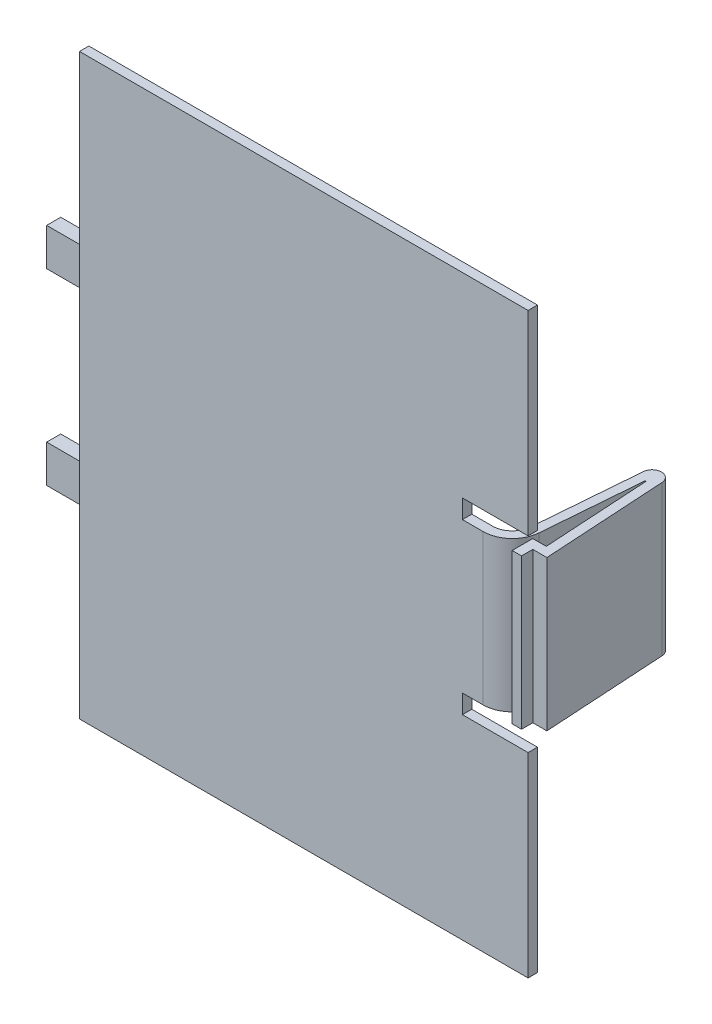
ISO-10303-21;
HEADER;
FILE_DESCRIPTION(('STEP AP214'),'2;1');
FILE_NAME('part.step','',(''),(''),'','','');
FILE_SCHEMA(('AUTOMOTIVE_DESIGN { 1 0 10303 214 1 1 1 1 }'));
ENDSEC;
DATA;
#1=APPLICATION_CONTEXT('core data for automotive mechanical design processes');
#2=APPLICATION_PROTOCOL_DEFINITION('international standard','automotive_design',2000,#1);
#3=PRODUCT_CONTEXT('',#1,'mechanical');
#4=PRODUCT('Part','Part','',(#3));
#5=PRODUCT_RELATED_PRODUCT_CATEGORY('part','',(#4));
#6=PRODUCT_DEFINITION_FORMATION('','',#4);
#7=PRODUCT_DEFINITION_CONTEXT('part definition',#1,'design');
#8=PRODUCT_DEFINITION('design','',#6,#7);
#9=PRODUCT_DEFINITION_SHAPE('','',#8);
#10=(LENGTH_UNIT() NAMED_UNIT(*) SI_UNIT(.MILLI.,.METRE.));
#11=(NAMED_UNIT(*) PLANE_ANGLE_UNIT() SI_UNIT($,.RADIAN.));
#12=(NAMED_UNIT(*) SI_UNIT($,.STERADIAN.) SOLID_ANGLE_UNIT());
#13=UNCERTAINTY_MEASURE_WITH_UNIT(LENGTH_MEASURE(1.E-05),#10,'distance_accuracy_value','');
#14=(GEOMETRIC_REPRESENTATION_CONTEXT(3) GLOBAL_UNCERTAINTY_ASSIGNED_CONTEXT((#13)) GLOBAL_UNIT_ASSIGNED_CONTEXT((#10,
#11,#12)) REPRESENTATION_CONTEXT('',''));
#15=CARTESIAN_POINT('',(0.,0.,0.));
#16=DIRECTION('',(0.,0.,1.));
#17=DIRECTION('',(1.,0.,0.));
#18=AXIS2_PLACEMENT_3D('',#15,#16,#17);
#19=CARTESIAN_POINT('',(-70.,0.,-1.));
#20=DIRECTION('',(1.,0.,0.));
#21=DIRECTION('',(0.,0.,-1.));
#22=AXIS2_PLACEMENT_3D('',#19,#20,#21);
#23=PLANE('',#22);
#24=DIRECTION('',(0.,1.,0.));
#25=VECTOR('',#24,1.);
#26=CARTESIAN_POINT('',(-70.,0.,-1.));
#27=LINE('',#26,#25);
#28=CARTESIAN_POINT('',(-70.,-10.,-1.));
#29=VERTEX_POINT('',#28);
#30=CARTESIAN_POINT('',(-70.,-8.,-1.));
#31=VERTEX_POINT('',#30);
#32=EDGE_CURVE('E452',#29,#31,#27,.T.);
#33=ORIENTED_EDGE('',*,*,#32,.T.);
#34=DIRECTION('',(0.,0.,1.));
#35=VECTOR('',#34,1.);
#36=CARTESIAN_POINT('',(-70.,-8.,-1.));
#37=LINE('',#36,#35);
#38=CARTESIAN_POINT('',(-70.,-8.,0.));
#39=VERTEX_POINT('',#38);
#40=EDGE_CURVE('E347',#31,#39,#37,.T.);
#41=ORIENTED_EDGE('',*,*,#40,.T.);
#42=DIRECTION('',(0.,1.,0.));
#43=VECTOR('',#42,1.);
#44=CARTESIAN_POINT('',(-70.,0.,0.));
#45=LINE('',#44,#43);
#46=CARTESIAN_POINT('',(-70.,-10.,0.));
#47=VERTEX_POINT('',#46);
#48=EDGE_CURVE('E478',#47,#39,#45,.T.);
#49=ORIENTED_EDGE('',*,*,#48,.F.);
#50=DIRECTION('',(0.,0.,1.));
#51=VECTOR('',#50,1.);
#52=CARTESIAN_POINT('',(-70.,-10.,-1.));
#53=LINE('',#52,#51);
#54=EDGE_CURVE('E44',#29,#47,#53,.T.);
#55=ORIENTED_EDGE('',*,*,#54,.F.);
#56=EDGE_LOOP('',(#33,#41,#49,#55));
#57=FACE_BOUND('',#56,.T.);
#58=ADVANCED_FACE('F35',(#57),#23,.T.);
#59=CARTESIAN_POINT('',(0.,0.,-1.));
#60=DIRECTION('',(0.,0.,1.));
#61=DIRECTION('',(1.,0.,0.));
#62=AXIS2_PLACEMENT_3D('',#59,#60,#61);
#63=PLANE('',#62);
#64=DIRECTION('',(-1.,0.,0.));
#65=VECTOR('',#64,1.);
#66=CARTESIAN_POINT('',(-115.3,8.00000000000001,-1.));
#67=LINE('',#66,#65);
#68=CARTESIAN_POINT('',(-106.3,8.00000000000001,-1.));
#69=VERTEX_POINT('',#68);
#70=CARTESIAN_POINT('',(-110.8,8.00000000000001,-1.));
#71=VERTEX_POINT('',#70);
#72=EDGE_CURVE('E61',#69,#71,#67,.T.);
#73=ORIENTED_EDGE('',*,*,#72,.F.);
#74=DIRECTION('',(0.,-1.,0.));
#75=VECTOR('',#74,1.);
#76=CARTESIAN_POINT('',(-106.3,12.,-1.));
#77=LINE('',#76,#75);
#78=CARTESIAN_POINT('',(-106.3,12.,-1.));
#79=VERTEX_POINT('',#78);
#80=EDGE_CURVE('E366',#79,#69,#77,.T.);
#81=ORIENTED_EDGE('',*,*,#80,.F.);
#82=DIRECTION('',(1.,0.,0.));
#83=VECTOR('',#82,1.);
#84=CARTESIAN_POINT('',(-115.3,12.,-1.));
#85=LINE('',#84,#83);
#86=CARTESIAN_POINT('',(-110.8,12.,-1.));
#87=VERTEX_POINT('',#86);
#88=EDGE_CURVE('E407',#87,#79,#85,.T.);
#89=ORIENTED_EDGE('',*,*,#88,.F.);
#90=DIRECTION('',(0.,-1.,0.));
#91=VECTOR('',#90,1.);
#92=CARTESIAN_POINT('',(-110.8,0.,-1.));
#93=LINE('',#92,#91);
#94=CARTESIAN_POINT('',(-110.8,30.8,-1.));
#95=VERTEX_POINT('',#94);
#96=EDGE_CURVE('E467',#95,#87,#93,.T.);
#97=ORIENTED_EDGE('',*,*,#96,.F.);
#98=DIRECTION('',(-1.,0.,0.));
#99=VECTOR('',#98,1.);
#100=CARTESIAN_POINT('',(0.,30.8,-1.));
#101=LINE('',#100,#99);
#102=CARTESIAN_POINT('',(-63.,30.8,-1.));
#103=VERTEX_POINT('',#102);
#104=EDGE_CURVE('E462',#103,#95,#101,.T.);
#105=ORIENTED_EDGE('',*,*,#104,.F.);
#106=DIRECTION('',(0.,1.,0.));
#107=VECTOR('',#106,1.);
#108=CARTESIAN_POINT('',(-63.,0.,-1.));
#109=LINE('',#108,#107);
#110=CARTESIAN_POINT('',(-63.,9.99999999999999,-1.));
#111=VERTEX_POINT('',#110);
#112=EDGE_CURVE('E459',#111,#103,#109,.T.);
#113=ORIENTED_EDGE('',*,*,#112,.F.);
#114=DIRECTION('',(1.,0.,0.));
#115=VECTOR('',#114,1.);
#116=CARTESIAN_POINT('',(0.,9.99999999999999,-1.));
#117=LINE('',#116,#115);
#118=CARTESIAN_POINT('',(-70.,9.99999999999999,-1.));
#119=VERTEX_POINT('',#118);
#120=EDGE_CURVE('E455',#119,#111,#117,.T.);
#121=ORIENTED_EDGE('',*,*,#120,.F.);
#122=CARTESIAN_POINT('',(-70.,8.,-1.));
#123=VERTEX_POINT('',#122);
#124=EDGE_CURVE('E456',#123,#119,#27,.T.);
#125=ORIENTED_EDGE('',*,*,#124,.F.);
#126=DIRECTION('',(-1.,0.,0.));
#127=VECTOR('',#126,1.);
#128=CARTESIAN_POINT('',(-67.7876273887767,8.,-1.));
#129=LINE('',#128,#127);
#130=CARTESIAN_POINT('',(-67.7876273887767,8.,-1.));
#131=VERTEX_POINT('',#130);
#132=EDGE_CURVE('E306',#131,#123,#129,.T.);
#133=ORIENTED_EDGE('',*,*,#132,.F.);
#134=DIRECTION('',(0.,1.,0.));
#135=VECTOR('',#134,1.);
#136=CARTESIAN_POINT('',(-67.7876273887767,-8.,-1.));
#137=LINE('',#136,#135);
#138=CARTESIAN_POINT('',(-67.7876273887767,-8.,-1.));
#139=VERTEX_POINT('',#138);
#140=EDGE_CURVE('E375',#139,#131,#137,.T.);
#141=ORIENTED_EDGE('',*,*,#140,.F.);
#142=DIRECTION('',(-1.,0.,0.));
#143=VECTOR('',#142,1.);
#144=CARTESIAN_POINT('',(-67.7876273887767,-8.,-1.));
#145=LINE('',#144,#143);
#146=EDGE_CURVE('E344',#139,#31,#145,.T.);
#147=ORIENTED_EDGE('',*,*,#146,.T.);
#148=ORIENTED_EDGE('',*,*,#32,.F.);
#149=DIRECTION('',(1.,0.,0.));
#150=VECTOR('',#149,1.);
#151=CARTESIAN_POINT('',(0.,-10.,-1.));
#152=LINE('',#151,#150);
#153=CARTESIAN_POINT('',(-63.,-10.,-1.));
#154=VERTEX_POINT('',#153);
#155=EDGE_CURVE('E476',#29,#154,#152,.T.);
#156=ORIENTED_EDGE('',*,*,#155,.T.);
#157=CARTESIAN_POINT('',(-63.,-30.8,-1.));
#158=VERTEX_POINT('',#157);
#159=EDGE_CURVE('E463',#158,#154,#109,.T.);
#160=ORIENTED_EDGE('',*,*,#159,.F.);
#161=DIRECTION('',(1.,0.,0.));
#162=VECTOR('',#161,1.);
#163=CARTESIAN_POINT('',(0.,-30.8,-1.));
#164=LINE('',#163,#162);
#165=CARTESIAN_POINT('',(-110.8,-30.8,-1.));
#166=VERTEX_POINT('',#165);
#167=EDGE_CURVE('E470',#166,#158,#164,.T.);
#168=ORIENTED_EDGE('',*,*,#167,.F.);
#169=CARTESIAN_POINT('',(-110.8,-12.,-1.));
#170=VERTEX_POINT('',#169);
#171=EDGE_CURVE('E466',#170,#166,#93,.T.);
#172=ORIENTED_EDGE('',*,*,#171,.F.);
#173=DIRECTION('',(-1.,0.,0.));
#174=VECTOR('',#173,1.);
#175=CARTESIAN_POINT('',(-115.3,-12.,-1.));
#176=LINE('',#175,#174);
#177=CARTESIAN_POINT('',(-106.3,-12.,-1.));
#178=VERTEX_POINT('',#177);
#179=EDGE_CURVE('E434',#178,#170,#176,.T.);
#180=ORIENTED_EDGE('',*,*,#179,.F.);
#181=DIRECTION('',(0.,-1.,0.));
#182=VECTOR('',#181,1.);
#183=CARTESIAN_POINT('',(-106.3,-7.99999999999999,-1.));
#184=LINE('',#183,#182);
#185=CARTESIAN_POINT('',(-106.3,-7.99999999999999,-1.));
#186=VERTEX_POINT('',#185);
#187=EDGE_CURVE('E420',#186,#178,#184,.T.);
#188=ORIENTED_EDGE('',*,*,#187,.F.);
#189=DIRECTION('',(1.,0.,0.));
#190=VECTOR('',#189,1.);
#191=CARTESIAN_POINT('',(-115.3,-7.99999999999999,-1.));
#192=LINE('',#191,#190);
#193=CARTESIAN_POINT('',(-110.8,-7.99999999999999,-1.));
#194=VERTEX_POINT('',#193);
#195=EDGE_CURVE('E11',#194,#186,#192,.T.);
#196=ORIENTED_EDGE('',*,*,#195,.F.);
#197=EDGE_CURVE('E472',#71,#194,#93,.T.);
#198=ORIENTED_EDGE('',*,*,#197,.F.);
#199=EDGE_LOOP('',(#73,#81,#89,#97,#105,#113,#121,#125,#133,#141,#147,#148,#156,#160,#168,#172,
#180,#188,#196,#198));
#200=FACE_BOUND('',#199,.T.);
#201=ADVANCED_FACE('F559',(#200),#63,.F.);
#202=DIRECTION('',(0.,0.,1.));
#203=VECTOR('',#202,1.);
#204=CARTESIAN_POINT('',(-70.,8.,-1.));
#205=LINE('',#204,#203);
#206=CARTESIAN_POINT('',(-70.,8.,0.));
#207=VERTEX_POINT('',#206);
#208=EDGE_CURVE('E308',#123,#207,#205,.T.);
#209=ORIENTED_EDGE('',*,*,#208,.F.);
#210=ORIENTED_EDGE('',*,*,#124,.T.);
#211=DIRECTION('',(0.,0.,1.));
#212=VECTOR('',#211,1.);
#213=CARTESIAN_POINT('',(-70.,9.99999999999999,-1.));
#214=LINE('',#213,#212);
#215=CARTESIAN_POINT('',(-70.,9.99999999999999,0.));
#216=VERTEX_POINT('',#215);
#217=EDGE_CURVE('E39',#119,#216,#214,.T.);
#218=ORIENTED_EDGE('',*,*,#217,.T.);
#219=EDGE_CURVE('E451',#207,#216,#45,.T.);
#220=ORIENTED_EDGE('',*,*,#219,.F.);
#221=EDGE_LOOP('',(#209,#210,#218,#220));
#222=FACE_BOUND('',#221,.T.);
#223=ADVANCED_FACE('F37',(#222),#23,.T.);
#224=CARTESIAN_POINT('',(0.,-10.,-1.));
#225=DIRECTION('',(0.,-1.,0.));
#226=DIRECTION('',(0.,0.,-1.));
#227=AXIS2_PLACEMENT_3D('',#224,#225,#226);
#228=PLANE('',#227);
#229=DIRECTION('',(1.,0.,0.));
#230=VECTOR('',#229,1.);
#231=CARTESIAN_POINT('',(0.,-10.,0.));
#232=LINE('',#231,#230);
#233=CARTESIAN_POINT('',(-63.,-10.,0.));
#234=VERTEX_POINT('',#233);
#235=EDGE_CURVE('E497',#47,#234,#232,.T.);
#236=ORIENTED_EDGE('',*,*,#235,.T.);
#237=DIRECTION('',(0.,0.,1.));
#238=VECTOR('',#237,1.);
#239=CARTESIAN_POINT('',(-63.,-10.,-1.));
#240=LINE('',#239,#238);
#241=EDGE_CURVE('E501',#154,#234,#240,.T.);
#242=ORIENTED_EDGE('',*,*,#241,.F.);
#243=ORIENTED_EDGE('',*,*,#155,.F.);
#244=ORIENTED_EDGE('',*,*,#54,.T.);
#245=EDGE_LOOP('',(#236,#242,#243,#244));
#246=FACE_BOUND('',#245,.T.);
#247=ADVANCED_FACE('F549',(#246),#228,.F.);
#248=CARTESIAN_POINT('',(-63.,0.,-1.));
#249=DIRECTION('',(1.,0.,0.));
#250=DIRECTION('',(0.,0.,-1.));
#251=AXIS2_PLACEMENT_3D('',#248,#249,#250);
#252=PLANE('',#251);
#253=DIRECTION('',(0.,1.,0.));
#254=VECTOR('',#253,1.);
#255=CARTESIAN_POINT('',(-63.,0.,0.));
#256=LINE('',#255,#254);
#257=CARTESIAN_POINT('',(-63.,-30.8,0.));
#258=VERTEX_POINT('',#257);
#259=EDGE_CURVE('E488',#258,#234,#256,.T.);
#260=ORIENTED_EDGE('',*,*,#259,.F.);
#261=DIRECTION('',(0.,0.,1.));
#262=VECTOR('',#261,1.);
#263=CARTESIAN_POINT('',(-63.,-30.8,-1.));
#264=LINE('',#263,#262);
#265=EDGE_CURVE('E503',#158,#258,#264,.T.);
#266=ORIENTED_EDGE('',*,*,#265,.F.);
#267=ORIENTED_EDGE('',*,*,#159,.T.);
#268=ORIENTED_EDGE('',*,*,#241,.T.);
#269=EDGE_LOOP('',(#260,#266,#267,#268));
#270=FACE_BOUND('',#269,.T.);
#271=ADVANCED_FACE('F545',(#270),#252,.T.);
#272=CARTESIAN_POINT('',(0.,-30.8,-1.));
#273=DIRECTION('',(0.,-1.,0.));
#274=DIRECTION('',(0.,0.,-1.));
#275=AXIS2_PLACEMENT_3D('',#272,#273,#274);
#276=PLANE('',#275);
#277=DIRECTION('',(1.,0.,0.));
#278=VECTOR('',#277,1.);
#279=CARTESIAN_POINT('',(0.,-30.8,0.));
#280=LINE('',#279,#278);
#281=CARTESIAN_POINT('',(-110.8,-30.8,0.));
#282=VERTEX_POINT('',#281);
#283=EDGE_CURVE('E494',#282,#258,#280,.T.);
#284=ORIENTED_EDGE('',*,*,#283,.F.);
#285=DIRECTION('',(0.,0.,1.));
#286=VECTOR('',#285,1.);
#287=CARTESIAN_POINT('',(-110.8,-30.8,-1.));
#288=LINE('',#287,#286);
#289=EDGE_CURVE('E505',#166,#282,#288,.T.);
#290=ORIENTED_EDGE('',*,*,#289,.F.);
#291=ORIENTED_EDGE('',*,*,#167,.T.);
#292=ORIENTED_EDGE('',*,*,#265,.T.);
#293=EDGE_LOOP('',(#284,#290,#291,#292));
#294=FACE_BOUND('',#293,.T.);
#295=ADVANCED_FACE('F540',(#294),#276,.T.);
#296=CARTESIAN_POINT('',(-110.8,0.,-1.));
#297=DIRECTION('',(-1.,0.,0.));
#298=DIRECTION('',(0.,-1.,0.));
#299=AXIS2_PLACEMENT_3D('',#296,#297,#298);
#300=PLANE('',#299);
#301=DIRECTION('',(0.,-1.,0.));
#302=VECTOR('',#301,1.);
#303=CARTESIAN_POINT('',(-110.8,0.,0.));
#304=LINE('',#303,#302);
#305=CARTESIAN_POINT('',(-110.8,30.8,0.));
#306=VERTEX_POINT('',#305);
#307=EDGE_CURVE('E491',#306,#282,#304,.T.);
#308=ORIENTED_EDGE('',*,*,#307,.F.);
#309=DIRECTION('',(0.,0.,1.));
#310=VECTOR('',#309,1.);
#311=CARTESIAN_POINT('',(-110.8,30.8,-1.));
#312=LINE('',#311,#310);
#313=EDGE_CURVE('E507',#95,#306,#312,.T.);
#314=ORIENTED_EDGE('',*,*,#313,.F.);
#315=ORIENTED_EDGE('',*,*,#96,.T.);
#316=EDGE_CURVE('E471',#87,#71,#93,.T.);
#317=ORIENTED_EDGE('',*,*,#316,.T.);
#318=ORIENTED_EDGE('',*,*,#197,.T.);
#319=EDGE_CURVE('E473',#194,#170,#93,.T.);
#320=ORIENTED_EDGE('',*,*,#319,.T.);
#321=ORIENTED_EDGE('',*,*,#171,.T.);
#322=ORIENTED_EDGE('',*,*,#289,.T.);
#323=EDGE_LOOP('',(#308,#314,#315,#317,#318,#320,#321,#322));
#324=FACE_BOUND('',#323,.T.);
#325=ADVANCED_FACE('F533',(#324),#300,.T.);
#326=CARTESIAN_POINT('',(0.,30.8,-1.));
#327=DIRECTION('',(0.,1.,0.));
#328=DIRECTION('',(0.,0.,1.));
#329=AXIS2_PLACEMENT_3D('',#326,#327,#328);
#330=PLANE('',#329);
#331=DIRECTION('',(-1.,0.,0.));
#332=VECTOR('',#331,1.);
#333=CARTESIAN_POINT('',(0.,30.8,0.));
#334=LINE('',#333,#332);
#335=CARTESIAN_POINT('',(-63.,30.8,0.));
#336=VERTEX_POINT('',#335);
#337=EDGE_CURVE('E487',#336,#306,#334,.T.);
#338=ORIENTED_EDGE('',*,*,#337,.F.);
#339=DIRECTION('',(0.,0.,1.));
#340=VECTOR('',#339,1.);
#341=CARTESIAN_POINT('',(-63.,30.8,-1.));
#342=LINE('',#341,#340);
#343=EDGE_CURVE('E509',#103,#336,#342,.T.);
#344=ORIENTED_EDGE('',*,*,#343,.F.);
#345=ORIENTED_EDGE('',*,*,#104,.T.);
#346=ORIENTED_EDGE('',*,*,#313,.T.);
#347=EDGE_LOOP('',(#338,#344,#345,#346));
#348=FACE_BOUND('',#347,.T.);
#349=ADVANCED_FACE('F529',(#348),#330,.T.);
#350=CARTESIAN_POINT('',(-63.,9.99999999999999,0.));
#351=VERTEX_POINT('',#350);
#352=EDGE_CURVE('E484',#351,#336,#256,.T.);
#353=ORIENTED_EDGE('',*,*,#352,.F.);
#354=DIRECTION('',(0.,0.,1.));
#355=VECTOR('',#354,1.);
#356=CARTESIAN_POINT('',(-63.,9.99999999999999,-1.));
#357=LINE('',#356,#355);
#358=EDGE_CURVE('E510',#111,#351,#357,.T.);
#359=ORIENTED_EDGE('',*,*,#358,.F.);
#360=ORIENTED_EDGE('',*,*,#112,.T.);
#361=ORIENTED_EDGE('',*,*,#343,.T.);
#362=EDGE_LOOP('',(#353,#359,#360,#361));
#363=FACE_BOUND('',#362,.T.);
#364=ADVANCED_FACE('F525',(#363),#252,.T.);
#365=CARTESIAN_POINT('',(0.,9.99999999999999,-1.));
#366=DIRECTION('',(0.,-1.,0.));
#367=DIRECTION('',(0.,0.,-1.));
#368=AXIS2_PLACEMENT_3D('',#365,#366,#367);
#369=PLANE('',#368);
#370=DIRECTION('',(1.,0.,0.));
#371=VECTOR('',#370,1.);
#372=CARTESIAN_POINT('',(0.,9.99999999999999,0.));
#373=LINE('',#372,#371);
#374=EDGE_CURVE('E481',#216,#351,#373,.T.);
#375=ORIENTED_EDGE('',*,*,#374,.F.);
#376=ORIENTED_EDGE('',*,*,#217,.F.);
#377=ORIENTED_EDGE('',*,*,#120,.T.);
#378=ORIENTED_EDGE('',*,*,#358,.T.);
#379=EDGE_LOOP('',(#375,#376,#377,#378));
#380=FACE_BOUND('',#379,.T.);
#381=ADVANCED_FACE('F521',(#380),#369,.T.);
#382=CARTESIAN_POINT('',(0.,0.,0.));
#383=DIRECTION('',(0.,0.,1.));
#384=DIRECTION('',(1.,0.,0.));
#385=AXIS2_PLACEMENT_3D('',#382,#383,#384);
#386=PLANE('',#385);
#387=ORIENTED_EDGE('',*,*,#48,.T.);
#388=DIRECTION('',(1.,0.,0.));
#389=VECTOR('',#388,1.);
#390=CARTESIAN_POINT('',(-70.,-8.,0.));
#391=LINE('',#390,#389);
#392=CARTESIAN_POINT('',(-67.7876273887767,-8.,0.));
#393=VERTEX_POINT('',#392);
#394=EDGE_CURVE('E350',#39,#393,#391,.T.);
#395=ORIENTED_EDGE('',*,*,#394,.T.);
#396=DIRECTION('',(0.,1.,0.));
#397=VECTOR('',#396,1.);
#398=CARTESIAN_POINT('',(-67.7876273887767,-8.,0.));
#399=LINE('',#398,#397);
#400=CARTESIAN_POINT('',(-67.7876273887767,8.,0.));
#401=VERTEX_POINT('',#400);
#402=EDGE_CURVE('E373',#393,#401,#399,.T.);
#403=ORIENTED_EDGE('',*,*,#402,.T.);
#404=DIRECTION('',(1.,0.,0.));
#405=VECTOR('',#404,1.);
#406=CARTESIAN_POINT('',(-70.,8.,0.));
#407=LINE('',#406,#405);
#408=EDGE_CURVE('E53',#207,#401,#407,.T.);
#409=ORIENTED_EDGE('',*,*,#408,.F.);
#410=ORIENTED_EDGE('',*,*,#219,.T.);
#411=ORIENTED_EDGE('',*,*,#374,.T.);
#412=ORIENTED_EDGE('',*,*,#352,.T.);
#413=ORIENTED_EDGE('',*,*,#337,.T.);
#414=ORIENTED_EDGE('',*,*,#307,.T.);
#415=ORIENTED_EDGE('',*,*,#283,.T.);
#416=ORIENTED_EDGE('',*,*,#259,.T.);
#417=ORIENTED_EDGE('',*,*,#235,.F.);
#418=EDGE_LOOP('',(#387,#395,#403,#409,#410,#411,#412,#413,#414,#415,#416,#417));
#419=FACE_BOUND('',#418,.T.);
#420=ADVANCED_FACE('F522',(#419),#386,.T.);
#421=CARTESIAN_POINT('',(0.,0.,-1.));
#422=DIRECTION('',(0.,0.,1.));
#423=DIRECTION('',(1.,0.,0.));
#424=AXIS2_PLACEMENT_3D('',#421,#422,#423);
#425=PLANE('',#424);
#426=ORIENTED_EDGE('',*,*,#319,.F.);
#427=CARTESIAN_POINT('',(-115.3,-7.99999999999999,-1.));
#428=VERTEX_POINT('',#427);
#429=EDGE_CURVE('E46',#428,#194,#192,.T.);
#430=ORIENTED_EDGE('',*,*,#429,.F.);
#431=DIRECTION('',(0.,1.,0.));
#432=VECTOR('',#431,1.);
#433=CARTESIAN_POINT('',(-115.3,-7.99999999999999,-1.));
#434=LINE('',#433,#432);
#435=CARTESIAN_POINT('',(-115.3,-12.,-1.));
#436=VERTEX_POINT('',#435);
#437=EDGE_CURVE('E437',#436,#428,#434,.T.);
#438=ORIENTED_EDGE('',*,*,#437,.F.);
#439=EDGE_CURVE('E433',#170,#436,#176,.T.);
#440=ORIENTED_EDGE('',*,*,#439,.F.);
#441=EDGE_LOOP('',(#426,#430,#438,#440));
#442=FACE_BOUND('',#441,.T.);
#443=ADVANCED_FACE('F614',(#442),#425,.T.);
#444=CARTESIAN_POINT('',(-106.3,-7.99999999999999,-2.5));
#445=DIRECTION('',(-1.,0.,0.));
#446=DIRECTION('',(0.,0.,1.));
#447=AXIS2_PLACEMENT_3D('',#444,#445,#446);
#448=PLANE('',#447);
#449=ORIENTED_EDGE('',*,*,#187,.T.);
#450=DIRECTION('',(0.,0.,1.));
#451=VECTOR('',#450,1.);
#452=CARTESIAN_POINT('',(-106.3,-12.,-2.5));
#453=LINE('',#452,#451);
#454=CARTESIAN_POINT('',(-106.3,-12.,-2.5));
#455=VERTEX_POINT('',#454);
#456=EDGE_CURVE('E448',#455,#178,#453,.T.);
#457=ORIENTED_EDGE('',*,*,#456,.F.);
#458=DIRECTION('',(0.,-1.,0.));
#459=VECTOR('',#458,1.);
#460=CARTESIAN_POINT('',(-106.3,-7.99999999999999,-2.5));
#461=LINE('',#460,#459);
#462=CARTESIAN_POINT('',(-106.3,-7.99999999999999,-2.5));
#463=VERTEX_POINT('',#462);
#464=EDGE_CURVE('E421',#463,#455,#461,.T.);
#465=ORIENTED_EDGE('',*,*,#464,.F.);
#466=DIRECTION('',(0.,0.,1.));
#467=VECTOR('',#466,1.);
#468=CARTESIAN_POINT('',(-106.3,-7.99999999999999,-2.5));
#469=LINE('',#468,#467);
#470=EDGE_CURVE('E430',#463,#186,#469,.T.);
#471=ORIENTED_EDGE('',*,*,#470,.T.);
#472=EDGE_LOOP('',(#449,#457,#465,#471));
#473=FACE_BOUND('',#472,.T.);
#474=ADVANCED_FACE('F621',(#473),#448,.F.);
#475=CARTESIAN_POINT('',(-115.3,-12.,-2.5));
#476=DIRECTION('',(0.,1.,0.));
#477=DIRECTION('',(-1.,0.,0.));
#478=AXIS2_PLACEMENT_3D('',#475,#476,#477);
#479=PLANE('',#478);
#480=ORIENTED_EDGE('',*,*,#179,.T.);
#481=ORIENTED_EDGE('',*,*,#439,.T.);
#482=DIRECTION('',(0.,0.,1.));
#483=VECTOR('',#482,1.);
#484=CARTESIAN_POINT('',(-115.3,-12.,-2.5));
#485=LINE('',#484,#483);
#486=CARTESIAN_POINT('',(-115.3,-12.,-2.5));
#487=VERTEX_POINT('',#486);
#488=EDGE_CURVE('E445',#487,#436,#485,.T.);
#489=ORIENTED_EDGE('',*,*,#488,.F.);
#490=DIRECTION('',(-1.,0.,0.));
#491=VECTOR('',#490,1.);
#492=CARTESIAN_POINT('',(-115.3,-12.,-2.5));
#493=LINE('',#492,#491);
#494=EDGE_CURVE('E424',#455,#487,#493,.T.);
#495=ORIENTED_EDGE('',*,*,#494,.F.);
#496=ORIENTED_EDGE('',*,*,#456,.T.);
#497=EDGE_LOOP('',(#480,#481,#489,#495,#496));
#498=FACE_BOUND('',#497,.T.);
#499=ADVANCED_FACE('F617',(#498),#479,.F.);
#500=CARTESIAN_POINT('',(-115.3,-7.99999999999999,-2.5));
#501=DIRECTION('',(1.,0.,0.));
#502=DIRECTION('',(0.,0.,-1.));
#503=AXIS2_PLACEMENT_3D('',#500,#501,#502);
#504=PLANE('',#503);
#505=ORIENTED_EDGE('',*,*,#437,.T.);
#506=DIRECTION('',(0.,0.,1.));
#507=VECTOR('',#506,1.);
#508=CARTESIAN_POINT('',(-115.3,-7.99999999999999,-2.5));
#509=LINE('',#508,#507);
#510=CARTESIAN_POINT('',(-115.3,-7.99999999999999,-2.5));
#511=VERTEX_POINT('',#510);
#512=EDGE_CURVE('E442',#511,#428,#509,.T.);
#513=ORIENTED_EDGE('',*,*,#512,.F.);
#514=DIRECTION('',(0.,1.,0.));
#515=VECTOR('',#514,1.);
#516=CARTESIAN_POINT('',(-115.3,-7.99999999999999,-2.5));
#517=LINE('',#516,#515);
#518=EDGE_CURVE('E426',#487,#511,#517,.T.);
#519=ORIENTED_EDGE('',*,*,#518,.F.);
#520=ORIENTED_EDGE('',*,*,#488,.T.);
#521=EDGE_LOOP('',(#505,#513,#519,#520));
#522=FACE_BOUND('',#521,.T.);
#523=ADVANCED_FACE('F629',(#522),#504,.F.);
#524=CARTESIAN_POINT('',(-115.3,-7.99999999999999,-2.5));
#525=DIRECTION('',(0.,-1.,0.));
#526=DIRECTION('',(1.,0.,0.));
#527=AXIS2_PLACEMENT_3D('',#524,#525,#526);
#528=PLANE('',#527);
#529=ORIENTED_EDGE('',*,*,#429,.T.);
#530=ORIENTED_EDGE('',*,*,#195,.T.);
#531=ORIENTED_EDGE('',*,*,#470,.F.);
#532=DIRECTION('',(1.,0.,0.));
#533=VECTOR('',#532,1.);
#534=CARTESIAN_POINT('',(-115.3,-7.99999999999999,-2.5));
#535=LINE('',#534,#533);
#536=EDGE_CURVE('E428',#511,#463,#535,.T.);
#537=ORIENTED_EDGE('',*,*,#536,.F.);
#538=ORIENTED_EDGE('',*,*,#512,.T.);
#539=EDGE_LOOP('',(#529,#530,#531,#537,#538));
#540=FACE_BOUND('',#539,.T.);
#541=ADVANCED_FACE('F624',(#540),#528,.F.);
#542=CARTESIAN_POINT('',(0.,0.,-2.5));
#543=DIRECTION('',(0.,0.,1.));
#544=DIRECTION('',(1.,0.,0.));
#545=AXIS2_PLACEMENT_3D('',#542,#543,#544);
#546=PLANE('',#545);
#547=ORIENTED_EDGE('',*,*,#464,.T.);
#548=ORIENTED_EDGE('',*,*,#494,.T.);
#549=ORIENTED_EDGE('',*,*,#518,.T.);
#550=ORIENTED_EDGE('',*,*,#536,.T.);
#551=EDGE_LOOP('',(#547,#548,#549,#550));
#552=FACE_BOUND('',#551,.T.);
#553=ADVANCED_FACE('F631',(#552),#546,.F.);
#554=CARTESIAN_POINT('',(-106.3,12.,-2.5));
#555=DIRECTION('',(-1.,0.,0.));
#556=DIRECTION('',(0.,0.,1.));
#557=AXIS2_PLACEMENT_3D('',#554,#555,#556);
#558=PLANE('',#557);
#559=ORIENTED_EDGE('',*,*,#80,.T.);
#560=DIRECTION('',(0.,0.,1.));
#561=VECTOR('',#560,1.);
#562=CARTESIAN_POINT('',(-106.3,8.00000000000001,-2.5));
#563=LINE('',#562,#561);
#564=CARTESIAN_POINT('',(-106.3,8.00000000000001,-2.5));
#565=VERTEX_POINT('',#564);
#566=EDGE_CURVE('E418',#565,#69,#563,.T.);
#567=ORIENTED_EDGE('',*,*,#566,.F.);
#568=DIRECTION('',(0.,-1.,0.));
#569=VECTOR('',#568,1.);
#570=CARTESIAN_POINT('',(-106.3,12.,-2.5));
#571=LINE('',#570,#569);
#572=CARTESIAN_POINT('',(-106.3,12.,-2.5));
#573=VERTEX_POINT('',#572);
#574=EDGE_CURVE('E390',#573,#565,#571,.T.);
#575=ORIENTED_EDGE('',*,*,#574,.F.);
#576=DIRECTION('',(0.,0.,1.));
#577=VECTOR('',#576,1.);
#578=CARTESIAN_POINT('',(-106.3,12.,-2.5));
#579=LINE('',#578,#577);
#580=EDGE_CURVE('E400',#573,#79,#579,.T.);
#581=ORIENTED_EDGE('',*,*,#580,.T.);
#582=EDGE_LOOP('',(#559,#567,#575,#581));
#583=FACE_BOUND('',#582,.T.);
#584=ADVANCED_FACE('F633',(#583),#558,.F.);
#585=CARTESIAN_POINT('',(-115.3,8.00000000000001,-2.5));
#586=DIRECTION('',(0.,1.,0.));
#587=DIRECTION('',(0.,0.,1.));
#588=AXIS2_PLACEMENT_3D('',#585,#586,#587);
#589=PLANE('',#588);
#590=ORIENTED_EDGE('',*,*,#72,.T.);
#591=CARTESIAN_POINT('',(-115.3,8.00000000000001,-1.));
#592=VERTEX_POINT('',#591);
#593=EDGE_CURVE('E403',#71,#592,#67,.T.);
#594=ORIENTED_EDGE('',*,*,#593,.T.);
#595=DIRECTION('',(0.,0.,1.));
#596=VECTOR('',#595,1.);
#597=CARTESIAN_POINT('',(-115.3,8.00000000000001,-2.5));
#598=LINE('',#597,#596);
#599=CARTESIAN_POINT('',(-115.3,8.00000000000001,-2.5));
#600=VERTEX_POINT('',#599);
#601=EDGE_CURVE('E415',#600,#592,#598,.T.);
#602=ORIENTED_EDGE('',*,*,#601,.F.);
#603=DIRECTION('',(-1.,0.,0.));
#604=VECTOR('',#603,1.);
#605=CARTESIAN_POINT('',(-115.3,8.00000000000001,-2.5));
#606=LINE('',#605,#604);
#607=EDGE_CURVE('E393',#565,#600,#606,.T.);
#608=ORIENTED_EDGE('',*,*,#607,.F.);
#609=ORIENTED_EDGE('',*,*,#566,.T.);
#610=EDGE_LOOP('',(#590,#594,#602,#608,#609));
#611=FACE_BOUND('',#610,.T.);
#612=ADVANCED_FACE('F639',(#611),#589,.F.);
#613=CARTESIAN_POINT('',(-115.3,12.,-2.5));
#614=DIRECTION('',(1.,0.,0.));
#615=DIRECTION('',(0.,0.,-1.));
#616=AXIS2_PLACEMENT_3D('',#613,#614,#615);
#617=PLANE('',#616);
#618=DIRECTION('',(0.,1.,0.));
#619=VECTOR('',#618,1.);
#620=CARTESIAN_POINT('',(-115.3,12.,-1.));
#621=LINE('',#620,#619);
#622=CARTESIAN_POINT('',(-115.3,12.,-1.));
#623=VERTEX_POINT('',#622);
#624=EDGE_CURVE('E405',#592,#623,#621,.T.);
#625=ORIENTED_EDGE('',*,*,#624,.T.);
#626=DIRECTION('',(0.,0.,1.));
#627=VECTOR('',#626,1.);
#628=CARTESIAN_POINT('',(-115.3,12.,-2.5));
#629=LINE('',#628,#627);
#630=CARTESIAN_POINT('',(-115.3,12.,-2.5));
#631=VERTEX_POINT('',#630);
#632=EDGE_CURVE('E412',#631,#623,#629,.T.);
#633=ORIENTED_EDGE('',*,*,#632,.F.);
#634=DIRECTION('',(0.,1.,0.));
#635=VECTOR('',#634,1.);
#636=CARTESIAN_POINT('',(-115.3,12.,-2.5));
#637=LINE('',#636,#635);
#638=EDGE_CURVE('E396',#600,#631,#637,.T.);
#639=ORIENTED_EDGE('',*,*,#638,.F.);
#640=ORIENTED_EDGE('',*,*,#601,.T.);
#641=EDGE_LOOP('',(#625,#633,#639,#640));
#642=FACE_BOUND('',#641,.T.);
#643=ADVANCED_FACE('F843',(#642),#617,.F.);
#644=CARTESIAN_POINT('',(-115.3,12.,-2.5));
#645=DIRECTION('',(0.,-1.,0.));
#646=DIRECTION('',(1.,0.,0.));
#647=AXIS2_PLACEMENT_3D('',#644,#645,#646);
#648=PLANE('',#647);
#649=EDGE_CURVE('E394',#623,#87,#85,.T.);
#650=ORIENTED_EDGE('',*,*,#649,.T.);
#651=ORIENTED_EDGE('',*,*,#88,.T.);
#652=ORIENTED_EDGE('',*,*,#580,.F.);
#653=DIRECTION('',(1.,0.,0.));
#654=VECTOR('',#653,1.);
#655=CARTESIAN_POINT('',(-115.3,12.,-2.5));
#656=LINE('',#655,#654);
#657=EDGE_CURVE('E398',#631,#573,#656,.T.);
#658=ORIENTED_EDGE('',*,*,#657,.F.);
#659=ORIENTED_EDGE('',*,*,#632,.T.);
#660=EDGE_LOOP('',(#650,#651,#652,#658,#659));
#661=FACE_BOUND('',#660,.T.);
#662=ADVANCED_FACE('F838',(#661),#648,.F.);
#663=CARTESIAN_POINT('',(0.,0.,-2.5));
#664=DIRECTION('',(0.,0.,1.));
#665=DIRECTION('',(1.,0.,0.));
#666=AXIS2_PLACEMENT_3D('',#663,#664,#665);
#667=PLANE('',#666);
#668=ORIENTED_EDGE('',*,*,#574,.T.);
#669=ORIENTED_EDGE('',*,*,#607,.T.);
#670=ORIENTED_EDGE('',*,*,#638,.T.);
#671=ORIENTED_EDGE('',*,*,#657,.T.);
#672=EDGE_LOOP('',(#668,#669,#670,#671));
#673=FACE_BOUND('',#672,.T.);
#674=ADVANCED_FACE('F835',(#673),#667,.F.);
#675=CARTESIAN_POINT('',(0.,0.,-1.));
#676=DIRECTION('',(0.,0.,1.));
#677=DIRECTION('',(1.,0.,0.));
#678=AXIS2_PLACEMENT_3D('',#675,#676,#677);
#679=PLANE('',#678);
#680=ORIENTED_EDGE('',*,*,#593,.F.);
#681=ORIENTED_EDGE('',*,*,#316,.F.);
#682=ORIENTED_EDGE('',*,*,#649,.F.);
#683=ORIENTED_EDGE('',*,*,#624,.F.);
#684=EDGE_LOOP('',(#680,#681,#682,#683));
#685=FACE_BOUND('',#684,.T.);
#686=ADVANCED_FACE('F717',(#685),#679,.T.);
#687=CARTESIAN_POINT('',(-63.0623700450365,-8.,-2.));
#688=DIRECTION('',(0.,0.,-1.));
#689=DIRECTION('',(-1.,0.,0.));
#690=AXIS2_PLACEMENT_3D('',#687,#688,#689);
#691=PLANE('',#690);
#692=DIRECTION('',(0.,1.,0.));
#693=VECTOR('',#692,1.);
#694=CARTESIAN_POINT('',(-64.5,-8.,-2.));
#695=LINE('',#694,#693);
#696=CARTESIAN_POINT('',(-64.5,-8.,-2.));
#697=VERTEX_POINT('',#696);
#698=CARTESIAN_POINT('',(-64.5,8.,-2.));
#699=VERTEX_POINT('',#698);
#700=EDGE_CURVE('E259',#697,#699,#695,.T.);
#701=ORIENTED_EDGE('',*,*,#700,.T.);
#702=DIRECTION('',(-1.,0.,0.));
#703=VECTOR('',#702,1.);
#704=CARTESIAN_POINT('',(-63.0623700450365,8.,-2.));
#705=LINE('',#704,#703);
#706=CARTESIAN_POINT('',(-63.0623700450365,8.,-2.));
#707=VERTEX_POINT('',#706);
#708=EDGE_CURVE('E263',#707,#699,#705,.T.);
#709=ORIENTED_EDGE('',*,*,#708,.F.);
#710=DIRECTION('',(0.,1.,0.));
#711=VECTOR('',#710,1.);
#712=CARTESIAN_POINT('',(-63.0623700450365,-8.,-2.));
#713=LINE('',#712,#711);
#714=CARTESIAN_POINT('',(-63.0623700450365,-8.,-2.));
#715=VERTEX_POINT('',#714);
#716=EDGE_CURVE('E364',#715,#707,#713,.T.);
#717=ORIENTED_EDGE('',*,*,#716,.F.);
#718=DIRECTION('',(-1.,0.,0.));
#719=VECTOR('',#718,1.);
#720=CARTESIAN_POINT('',(-63.0623700450365,-8.,-2.));
#721=LINE('',#720,#719);
#722=EDGE_CURVE('E265',#715,#697,#721,.T.);
#723=ORIENTED_EDGE('',*,*,#722,.T.);
#724=EDGE_LOOP('',(#701,#709,#717,#723));
#725=FACE_BOUND('',#724,.T.);
#726=ADVANCED_FACE('F261',(#725),#691,.T.);
#727=CARTESIAN_POINT('',(-63.7466462387656,-8.,-13.3030225366373));
#728=DIRECTION('',(-0.998172523025577,0.,0.0604285882406183));
#729=DIRECTION('',(0.0604285882406183,0.,0.998172523025577));
#730=AXIS2_PLACEMENT_3D('',#727,#728,#729);
#731=PLANE('',#730);
#732=ORIENTED_EDGE('',*,*,#716,.T.);
#733=DIRECTION('',(0.0604285882406183,0.,0.998172523025577));
#734=VECTOR('',#733,1.);
#735=CARTESIAN_POINT('',(-63.7466462387656,8.,-13.3030225366373));
#736=LINE('',#735,#734);
#737=CARTESIAN_POINT('',(-63.7466462387656,8.,-13.3030225366373));
#738=VERTEX_POINT('',#737);
#739=EDGE_CURVE('E284',#738,#707,#736,.T.);
#740=ORIENTED_EDGE('',*,*,#739,.F.);
#741=DIRECTION('',(0.,1.,0.));
#742=VECTOR('',#741,1.);
#743=CARTESIAN_POINT('',(-63.7466462387656,-8.,-13.3030225366373));
#744=LINE('',#743,#742);
#745=CARTESIAN_POINT('',(-63.7466462387656,-8.,-13.3030225366373));
#746=VERTEX_POINT('',#745);
#747=EDGE_CURVE('E367',#746,#738,#744,.T.);
#748=ORIENTED_EDGE('',*,*,#747,.F.);
#749=DIRECTION('',(0.0604285882406183,0.,0.998172523025577));
#750=VECTOR('',#749,1.);
#751=CARTESIAN_POINT('',(-63.7466462387656,-8.,-13.3030225366373));
#752=LINE('',#751,#750);
#753=EDGE_CURVE('E270',#746,#715,#752,.T.);
#754=ORIENTED_EDGE('',*,*,#753,.T.);
#755=EDGE_LOOP('',(#732,#740,#748,#754));
#756=FACE_BOUND('',#755,.T.);
#757=ADVANCED_FACE('F590',(#756),#731,.T.);
#758=CARTESIAN_POINT('',(-63.7959729512947,-8.,-13.3000363358234));
#759=DIRECTION('',(0.,1.,0.));
#760=DIRECTION('',(0.,0.,1.));
#761=AXIS2_PLACEMENT_3D('',#758,#759,#760);
#762=CYLINDRICAL_SURFACE('',#761,0.0494170209971067);
#763=ORIENTED_EDGE('',*,*,#747,.T.);
#764=CARTESIAN_POINT('',(-63.7959729512947,8.,-13.3000363358234));
#765=DIRECTION('',(0.,-1.,0.));
#766=DIRECTION('',(0.,0.,1.));
#767=AXIS2_PLACEMENT_3D('',#764,#765,#766);
#768=CIRCLE('',#767,0.0494170209971067);
#769=CARTESIAN_POINT('',(-63.845228573102,8.,-13.3040270355865));
#770=VERTEX_POINT('',#769);
#771=EDGE_CURVE('E317',#770,#738,#768,.T.);
#772=ORIENTED_EDGE('',*,*,#771,.F.);
#773=DIRECTION('',(0.,1.,0.));
#774=VECTOR('',#773,1.);
#775=CARTESIAN_POINT('',(-63.845228573102,-8.,-13.3040270355865));
#776=LINE('',#775,#774);
#777=CARTESIAN_POINT('',(-63.845228573102,-8.,-13.3040270355865));
#778=VERTEX_POINT('',#777);
#779=EDGE_CURVE('E369',#778,#770,#776,.T.);
#780=ORIENTED_EDGE('',*,*,#779,.F.);
#781=CARTESIAN_POINT('',(-63.7959729512947,-8.,-13.3000363358234));
#782=DIRECTION('',(0.,-1.,0.));
#783=DIRECTION('',(0.,0.,1.));
#784=AXIS2_PLACEMENT_3D('',#781,#782,#783);
#785=CIRCLE('',#784,0.0494170209971067);
#786=EDGE_CURVE('E359',#778,#746,#785,.T.);
#787=ORIENTED_EDGE('',*,*,#786,.T.);
#788=EDGE_LOOP('',(#763,#772,#780,#787));
#789=FACE_BOUND('',#788,.T.);
#790=ADVANCED_FACE('F593',(#789),#762,.F.);
#791=CARTESIAN_POINT('',(-64.6917986911369,-8.,-2.85514838193675));
#792=DIRECTION('',(0.996733935261764,0.,0.080755571309959));
#793=DIRECTION('',(0.080755571309959,0.,-0.996733935261764));
#794=AXIS2_PLACEMENT_3D('',#791,#792,#793);
#795=PLANE('',#794);
#796=ORIENTED_EDGE('',*,*,#779,.T.);
#797=DIRECTION('',(0.0807555713099589,0.,-0.996733935261764));
#798=VECTOR('',#797,1.);
#799=CARTESIAN_POINT('',(-64.6917986911369,8.,-2.85514838193675));
#800=LINE('',#799,#798);
#801=CARTESIAN_POINT('',(-64.6917986911369,8.,-2.85514838193675));
#802=VERTEX_POINT('',#801);
#803=EDGE_CURVE('E314',#802,#770,#800,.T.);
#804=ORIENTED_EDGE('',*,*,#803,.F.);
#805=DIRECTION('',(0.,1.,0.));
#806=VECTOR('',#805,1.);
#807=CARTESIAN_POINT('',(-64.6917986911369,-8.,-2.85514838193675));
#808=LINE('',#807,#806);
#809=CARTESIAN_POINT('',(-64.6917986911369,-8.,-2.85514838193675));
#810=VERTEX_POINT('',#809);
#811=EDGE_CURVE('E371',#810,#802,#808,.T.);
#812=ORIENTED_EDGE('',*,*,#811,.F.);
#813=DIRECTION('',(0.0807555713099589,0.,-0.996733935261764));
#814=VECTOR('',#813,1.);
#815=CARTESIAN_POINT('',(-64.6917986911369,-8.,-2.85514838193675));
#816=LINE('',#815,#814);
#817=EDGE_CURVE('E356',#810,#778,#816,.T.);
#818=ORIENTED_EDGE('',*,*,#817,.T.);
#819=EDGE_LOOP('',(#796,#804,#812,#818));
#820=FACE_BOUND('',#819,.T.);
#821=ADVANCED_FACE('F596',(#820),#795,.T.);
#822=CARTESIAN_POINT('',(-67.7876273887767,-8.,-3.10597300655441));
#823=DIRECTION('',(0.,1.,0.));
#824=DIRECTION('',(0.,0.,1.));
#825=AXIS2_PLACEMENT_3D('',#822,#823,#824);
#826=CYLINDRICAL_SURFACE('',#825,3.1059730065544);
#827=ORIENTED_EDGE('',*,*,#811,.T.);
#828=CARTESIAN_POINT('',(-67.7876273887767,8.,-3.10597300655441));
#829=DIRECTION('',(0.,1.,0.));
#830=DIRECTION('',(0.,0.,1.));
#831=AXIS2_PLACEMENT_3D('',#828,#829,#830);
#832=CIRCLE('',#831,3.1059730065544);
#833=EDGE_CURVE('E311',#401,#802,#832,.T.);
#834=ORIENTED_EDGE('',*,*,#833,.F.);
#835=ORIENTED_EDGE('',*,*,#402,.F.);
#836=CARTESIAN_POINT('',(-67.7876273887767,-8.,-3.10597300655441));
#837=DIRECTION('',(0.,1.,0.));
#838=DIRECTION('',(0.,0.,1.));
#839=AXIS2_PLACEMENT_3D('',#836,#837,#838);
#840=CIRCLE('',#839,3.1059730065544);
#841=EDGE_CURVE('E353',#393,#810,#840,.T.);
#842=ORIENTED_EDGE('',*,*,#841,.T.);
#843=EDGE_LOOP('',(#827,#834,#835,#842));
#844=FACE_BOUND('',#843,.T.);
#845=ADVANCED_FACE('F600',(#844),#826,.T.);
#846=CARTESIAN_POINT('',(-67.7876273887767,-8.,-3.10597300655441));
#847=DIRECTION('',(0.,1.,0.));
#848=DIRECTION('',(0.,0.,1.));
#849=AXIS2_PLACEMENT_3D('',#846,#847,#848);
#850=CYLINDRICAL_SURFACE('',#849,2.10597300655441);
#851=ORIENTED_EDGE('',*,*,#140,.T.);
#852=CARTESIAN_POINT('',(-67.7876273887767,8.,-3.10597300655441));
#853=DIRECTION('',(0.,-1.,0.));
#854=DIRECTION('',(0.,0.,1.));
#855=AXIS2_PLACEMENT_3D('',#852,#853,#854);
#856=CIRCLE('',#855,2.10597300655441);
#857=CARTESIAN_POINT('',(-65.6885326263987,8.,-2.93590395324672));
#858=VERTEX_POINT('',#857);
#859=EDGE_CURVE('E303',#858,#131,#856,.T.);
#860=ORIENTED_EDGE('',*,*,#859,.F.);
#861=DIRECTION('',(0.,1.,0.));
#862=VECTOR('',#861,1.);
#863=CARTESIAN_POINT('',(-65.6885326263987,-8.,-2.93590395324672));
#864=LINE('',#863,#862);
#865=CARTESIAN_POINT('',(-65.6885326263987,-8.,-2.93590395324672));
#866=VERTEX_POINT('',#865);
#867=EDGE_CURVE('E377',#866,#858,#864,.T.);
#868=ORIENTED_EDGE('',*,*,#867,.F.);
#869=CARTESIAN_POINT('',(-67.7876273887767,-8.,-3.10597300655441));
#870=DIRECTION('',(0.,-1.,0.));
#871=DIRECTION('',(0.,0.,1.));
#872=AXIS2_PLACEMENT_3D('',#869,#870,#871);
#873=CIRCLE('',#872,2.10597300655441);
#874=EDGE_CURVE('E341',#866,#139,#873,.T.);
#875=ORIENTED_EDGE('',*,*,#874,.T.);
#876=EDGE_LOOP('',(#851,#860,#868,#875));
#877=FACE_BOUND('',#876,.T.);
#878=ADVANCED_FACE('F563',(#877),#850,.F.);
#879=CARTESIAN_POINT('',(-64.7855746476028,-8.,-14.08075557131));
#880=DIRECTION('',(-0.996733935261766,0.,-0.0807555713099373));
#881=DIRECTION('',(-0.0807555713099373,0.,0.996733935261766));
#882=AXIS2_PLACEMENT_3D('',#879,#880,#881);
#883=PLANE('',#882);
#884=ORIENTED_EDGE('',*,*,#867,.T.);
#885=DIRECTION('',(-0.0807555713099373,0.,0.996733935261766));
#886=VECTOR('',#885,1.);
#887=CARTESIAN_POINT('',(-64.7855746476028,8.,-14.08075557131));
#888=LINE('',#887,#886);
#889=CARTESIAN_POINT('',(-64.7855746476028,8.,-14.08075557131));
#890=VERTEX_POINT('',#889);
#891=EDGE_CURVE('E300',#890,#858,#888,.T.);
#892=ORIENTED_EDGE('',*,*,#891,.F.);
#893=DIRECTION('',(0.,1.,0.));
#894=VECTOR('',#893,1.);
#895=CARTESIAN_POINT('',(-64.7855746476028,-8.,-14.08075557131));
#896=LINE('',#895,#894);
#897=CARTESIAN_POINT('',(-64.7855746476028,-8.,-14.08075557131));
#898=VERTEX_POINT('',#897);
#899=EDGE_CURVE('E379',#898,#890,#896,.T.);
#900=ORIENTED_EDGE('',*,*,#899,.F.);
#901=DIRECTION('',(-0.0807555713099373,0.,0.996733935261766));
#902=VECTOR('',#901,1.);
#903=CARTESIAN_POINT('',(-64.7855746476028,-8.,-14.08075557131));
#904=LINE('',#903,#902);
#905=EDGE_CURVE('E338',#898,#866,#904,.T.);
#906=ORIENTED_EDGE('',*,*,#905,.T.);
#907=EDGE_LOOP('',(#884,#892,#900,#906));
#908=FACE_BOUND('',#907,.T.);
#909=ADVANCED_FACE('F567',(#908),#883,.T.);
#910=CARTESIAN_POINT('',(-63.7888407123414,-8.,-14.));
#911=DIRECTION('',(0.,1.,0.));
#912=DIRECTION('',(0.,0.,1.));
#913=AXIS2_PLACEMENT_3D('',#910,#911,#912);
#914=CYLINDRICAL_SURFACE('',#913,0.999999999999821);
#915=ORIENTED_EDGE('',*,*,#899,.T.);
#916=CARTESIAN_POINT('',(-63.7888407123414,8.,-14.));
#917=DIRECTION('',(0.,1.,0.));
#918=DIRECTION('',(0.,0.,1.));
#919=AXIS2_PLACEMENT_3D('',#916,#917,#918);
#920=CIRCLE('',#919,0.999999999999821);
#921=CARTESIAN_POINT('',(-62.790668189316,8.,-14.0604285882406));
#922=VERTEX_POINT('',#921);
#923=EDGE_CURVE('E297',#922,#890,#920,.T.);
#924=ORIENTED_EDGE('',*,*,#923,.F.);
#925=DIRECTION('',(0.,1.,0.));
#926=VECTOR('',#925,1.);
#927=CARTESIAN_POINT('',(-62.790668189316,-8.,-14.0604285882406));
#928=LINE('',#927,#926);
#929=CARTESIAN_POINT('',(-62.790668189316,-8.,-14.0604285882406));
#930=VERTEX_POINT('',#929);
#931=EDGE_CURVE('E381',#930,#922,#928,.T.);
#932=ORIENTED_EDGE('',*,*,#931,.F.);
#933=CARTESIAN_POINT('',(-63.7888407123414,-8.,-14.));
#934=DIRECTION('',(0.,1.,0.));
#935=DIRECTION('',(0.,0.,1.));
#936=AXIS2_PLACEMENT_3D('',#933,#934,#935);
#937=CIRCLE('',#936,0.999999999999821);
#938=EDGE_CURVE('E335',#930,#898,#937,.T.);
#939=ORIENTED_EDGE('',*,*,#938,.T.);
#940=EDGE_LOOP('',(#915,#924,#932,#939));
#941=FACE_BOUND('',#940,.T.);
#942=ADVANCED_FACE('F572',(#941),#914,.T.);
#943=CARTESIAN_POINT('',(-62.,-8.,-1.));
#944=DIRECTION('',(0.998172523025574,0.,-0.0604285882406688));
#945=DIRECTION('',(-0.0604285882406688,0.,-0.998172523025574));
#946=AXIS2_PLACEMENT_3D('',#943,#944,#945);
#947=PLANE('',#946);
#948=ORIENTED_EDGE('',*,*,#931,.T.);
#949=DIRECTION('',(-0.0604285882406688,0.,-0.998172523025574));
#950=VECTOR('',#949,1.);
#951=CARTESIAN_POINT('',(-62.,8.,-1.));
#952=LINE('',#951,#950);
#953=CARTESIAN_POINT('',(-62.,8.,-1.));
#954=VERTEX_POINT('',#953);
#955=EDGE_CURVE('E294',#954,#922,#952,.T.);
#956=ORIENTED_EDGE('',*,*,#955,.F.);
#957=DIRECTION('',(0.,1.,0.));
#958=VECTOR('',#957,1.);
#959=CARTESIAN_POINT('',(-62.,-8.,-1.));
#960=LINE('',#959,#958);
#961=CARTESIAN_POINT('',(-62.,-8.,-1.));
#962=VERTEX_POINT('',#961);
#963=EDGE_CURVE('E383',#962,#954,#960,.T.);
#964=ORIENTED_EDGE('',*,*,#963,.F.);
#965=DIRECTION('',(-0.0604285882406688,0.,-0.998172523025574));
#966=VECTOR('',#965,1.);
#967=CARTESIAN_POINT('',(-62.,-8.,-1.));
#968=LINE('',#967,#966);
#969=EDGE_CURVE('E332',#962,#930,#968,.T.);
#970=ORIENTED_EDGE('',*,*,#969,.T.);
#971=EDGE_LOOP('',(#948,#956,#964,#970));
#972=FACE_BOUND('',#971,.T.);
#973=ADVANCED_FACE('F575',(#972),#947,.T.);
#974=CARTESIAN_POINT('',(-63.5,-8.,-1.));
#975=DIRECTION('',(0.,0.,1.));
#976=DIRECTION('',(1.,0.,0.));
#977=AXIS2_PLACEMENT_3D('',#974,#975,#976);
#978=PLANE('',#977);
#979=ORIENTED_EDGE('',*,*,#963,.T.);
#980=DIRECTION('',(1.,0.,0.));
#981=VECTOR('',#980,1.);
#982=CARTESIAN_POINT('',(-63.5,8.,-1.));
#983=LINE('',#982,#981);
#984=CARTESIAN_POINT('',(-63.5,8.,-1.));
#985=VERTEX_POINT('',#984);
#986=EDGE_CURVE('E291',#985,#954,#983,.T.);
#987=ORIENTED_EDGE('',*,*,#986,.F.);
#988=DIRECTION('',(0.,1.,0.));
#989=VECTOR('',#988,1.);
#990=CARTESIAN_POINT('',(-63.5,-8.,-1.));
#991=LINE('',#990,#989);
#992=CARTESIAN_POINT('',(-63.5,-8.,-1.));
#993=VERTEX_POINT('',#992);
#994=EDGE_CURVE('E385',#993,#985,#991,.T.);
#995=ORIENTED_EDGE('',*,*,#994,.F.);
#996=DIRECTION('',(1.,0.,0.));
#997=VECTOR('',#996,1.);
#998=CARTESIAN_POINT('',(-63.5,-8.,-1.));
#999=LINE('',#998,#997);
#1000=EDGE_CURVE('E329',#993,#962,#999,.T.);
#1001=ORIENTED_EDGE('',*,*,#1000,.T.);
#1002=EDGE_LOOP('',(#979,#987,#995,#1001));
#1003=FACE_BOUND('',#1002,.T.);
#1004=ADVANCED_FACE('F579',(#1003),#978,.T.);
#1005=CARTESIAN_POINT('',(-63.5,-8.,0.2));
#1006=DIRECTION('',(1.,0.,0.));
#1007=DIRECTION('',(0.,0.,-1.));
#1008=AXIS2_PLACEMENT_3D('',#1005,#1006,#1007);
#1009=PLANE('',#1008);
#1010=ORIENTED_EDGE('',*,*,#994,.T.);
#1011=DIRECTION('',(0.,0.,-1.));
#1012=VECTOR('',#1011,1.);
#1013=CARTESIAN_POINT('',(-63.5,8.,0.2));
#1014=LINE('',#1013,#1012);
#1015=CARTESIAN_POINT('',(-63.5,8.,0.2));
#1016=VERTEX_POINT('',#1015);
#1017=EDGE_CURVE('E288',#1016,#985,#1014,.T.);
#1018=ORIENTED_EDGE('',*,*,#1017,.F.);
#1019=DIRECTION('',(0.,1.,0.));
#1020=VECTOR('',#1019,1.);
#1021=CARTESIAN_POINT('',(-63.5,-8.,0.2));
#1022=LINE('',#1021,#1020);
#1023=CARTESIAN_POINT('',(-63.5,-8.,0.2));
#1024=VERTEX_POINT('',#1023);
#1025=EDGE_CURVE('E387',#1024,#1016,#1022,.T.);
#1026=ORIENTED_EDGE('',*,*,#1025,.F.);
#1027=DIRECTION('',(0.,0.,-1.));
#1028=VECTOR('',#1027,1.);
#1029=CARTESIAN_POINT('',(-63.5,-8.,0.2));
#1030=LINE('',#1029,#1028);
#1031=EDGE_CURVE('E326',#1024,#993,#1030,.T.);
#1032=ORIENTED_EDGE('',*,*,#1031,.T.);
#1033=EDGE_LOOP('',(#1010,#1018,#1026,#1032));
#1034=FACE_BOUND('',#1033,.T.);
#1035=ADVANCED_FACE('F584',(#1034),#1009,.T.);
#1036=CARTESIAN_POINT('',(-64.5,-8.,0.2));
#1037=DIRECTION('',(0.,0.,1.));
#1038=DIRECTION('',(1.,0.,0.));
#1039=AXIS2_PLACEMENT_3D('',#1036,#1037,#1038);
#1040=PLANE('',#1039);
#1041=ORIENTED_EDGE('',*,*,#1025,.T.);
#1042=DIRECTION('',(1.,0.,0.));
#1043=VECTOR('',#1042,1.);
#1044=CARTESIAN_POINT('',(-64.5,8.,0.2));
#1045=LINE('',#1044,#1043);
#1046=CARTESIAN_POINT('',(-64.5,8.,0.2));
#1047=VERTEX_POINT('',#1046);
#1048=EDGE_CURVE('E278',#1047,#1016,#1045,.T.);
#1049=ORIENTED_EDGE('',*,*,#1048,.F.);
#1050=DIRECTION('',(0.,1.,0.));
#1051=VECTOR('',#1050,1.);
#1052=CARTESIAN_POINT('',(-64.5,-8.,0.2));
#1053=LINE('',#1052,#1051);
#1054=CARTESIAN_POINT('',(-64.5,-8.,0.2));
#1055=VERTEX_POINT('',#1054);
#1056=EDGE_CURVE('E269',#1055,#1047,#1053,.T.);
#1057=ORIENTED_EDGE('',*,*,#1056,.F.);
#1058=DIRECTION('',(1.,0.,0.));
#1059=VECTOR('',#1058,1.);
#1060=CARTESIAN_POINT('',(-64.5,-8.,0.2));
#1061=LINE('',#1060,#1059);
#1062=EDGE_CURVE('E323',#1055,#1024,#1061,.T.);
#1063=ORIENTED_EDGE('',*,*,#1062,.T.);
#1064=EDGE_LOOP('',(#1041,#1049,#1057,#1063));
#1065=FACE_BOUND('',#1064,.T.);
#1066=ADVANCED_FACE('F586',(#1065),#1040,.T.);
#1067=CARTESIAN_POINT('',(-64.5,-8.,-2.));
#1068=DIRECTION('',(-1.,0.,0.));
#1069=DIRECTION('',(0.,0.,1.));
#1070=AXIS2_PLACEMENT_3D('',#1067,#1068,#1069);
#1071=PLANE('',#1070);
#1072=ORIENTED_EDGE('',*,*,#1056,.T.);
#1073=DIRECTION('',(0.,0.,1.));
#1074=VECTOR('',#1073,1.);
#1075=CARTESIAN_POINT('',(-64.5,8.,-2.));
#1076=LINE('',#1075,#1074);
#1077=EDGE_CURVE('E273',#699,#1047,#1076,.T.);
#1078=ORIENTED_EDGE('',*,*,#1077,.F.);
#1079=ORIENTED_EDGE('',*,*,#700,.F.);
#1080=DIRECTION('',(0.,0.,1.));
#1081=VECTOR('',#1080,1.);
#1082=CARTESIAN_POINT('',(-64.5,-8.,-2.));
#1083=LINE('',#1082,#1081);
#1084=EDGE_CURVE('E321',#697,#1055,#1083,.T.);
#1085=ORIENTED_EDGE('',*,*,#1084,.T.);
#1086=EDGE_LOOP('',(#1072,#1078,#1079,#1085));
#1087=FACE_BOUND('',#1086,.T.);
#1088=ADVANCED_FACE('F274',(#1087),#1071,.T.);
#1089=CARTESIAN_POINT('',(-63.7888407123414,-8.,-14.));
#1090=DIRECTION('',(0.,1.,0.));
#1091=DIRECTION('',(0.,0.,1.));
#1092=AXIS2_PLACEMENT_3D('',#1089,#1090,#1091);
#1093=PLANE('',#1092);
#1094=ORIENTED_EDGE('',*,*,#722,.F.);
#1095=ORIENTED_EDGE('',*,*,#753,.F.);
#1096=ORIENTED_EDGE('',*,*,#786,.F.);
#1097=ORIENTED_EDGE('',*,*,#817,.F.);
#1098=ORIENTED_EDGE('',*,*,#841,.F.);
#1099=ORIENTED_EDGE('',*,*,#394,.F.);
#1100=ORIENTED_EDGE('',*,*,#40,.F.);
#1101=ORIENTED_EDGE('',*,*,#146,.F.);
#1102=ORIENTED_EDGE('',*,*,#874,.F.);
#1103=ORIENTED_EDGE('',*,*,#905,.F.);
#1104=ORIENTED_EDGE('',*,*,#938,.F.);
#1105=ORIENTED_EDGE('',*,*,#969,.F.);
#1106=ORIENTED_EDGE('',*,*,#1000,.F.);
#1107=ORIENTED_EDGE('',*,*,#1031,.F.);
#1108=ORIENTED_EDGE('',*,*,#1062,.F.);
#1109=ORIENTED_EDGE('',*,*,#1084,.F.);
#1110=EDGE_LOOP('',(#1094,#1095,#1096,#1097,#1098,#1099,#1100,#1101,#1102,#1103,#1104,#1105,
#1106,#1107,#1108,#1109));
#1111=FACE_BOUND('',#1110,.T.);
#1112=ADVANCED_FACE('F555',(#1111),#1093,.F.);
#1113=CARTESIAN_POINT('',(-63.7888407123414,8.,-14.));
#1114=DIRECTION('',(0.,1.,0.));
#1115=DIRECTION('',(0.,0.,1.));
#1116=AXIS2_PLACEMENT_3D('',#1113,#1114,#1115);
#1117=PLANE('',#1116);
#1118=ORIENTED_EDGE('',*,*,#708,.T.);
#1119=ORIENTED_EDGE('',*,*,#1077,.T.);
#1120=ORIENTED_EDGE('',*,*,#1048,.T.);
#1121=ORIENTED_EDGE('',*,*,#1017,.T.);
#1122=ORIENTED_EDGE('',*,*,#986,.T.);
#1123=ORIENTED_EDGE('',*,*,#955,.T.);
#1124=ORIENTED_EDGE('',*,*,#923,.T.);
#1125=ORIENTED_EDGE('',*,*,#891,.T.);
#1126=ORIENTED_EDGE('',*,*,#859,.T.);
#1127=ORIENTED_EDGE('',*,*,#132,.T.);
#1128=ORIENTED_EDGE('',*,*,#208,.T.);
#1129=ORIENTED_EDGE('',*,*,#408,.T.);
#1130=ORIENTED_EDGE('',*,*,#833,.T.);
#1131=ORIENTED_EDGE('',*,*,#803,.T.);
#1132=ORIENTED_EDGE('',*,*,#771,.T.);
#1133=ORIENTED_EDGE('',*,*,#739,.T.);
#1134=EDGE_LOOP('',(#1118,#1119,#1120,#1121,#1122,#1123,#1124,#1125,#1126,#1127,#1128,#1129,
#1130,#1131,#1132,#1133));
#1135=FACE_BOUND('',#1134,.T.);
#1136=ADVANCED_FACE('F281',(#1135),#1117,.T.);
#1137=CLOSED_SHELL('',(#58,#201,#223,#247,#271,#295,#325,#349,#364,#381,#420,#443,#474,#499,
#523,#541,#553,#584,#612,#643,#662,#674,#686,#726,#757,#790,#821,#845,#878,#909,#942,#973,#1004,
#1035,#1066,#1088,#1112,#1136));
#1138=MANIFOLD_SOLID_BREP('B2',#1137);
#1139=ADVANCED_BREP_SHAPE_REPRESENTATION('',(#18,#1138),#14);
#1140=SHAPE_DEFINITION_REPRESENTATION(#9,#1139);
ENDSEC;
END-ISO-10303-21;
